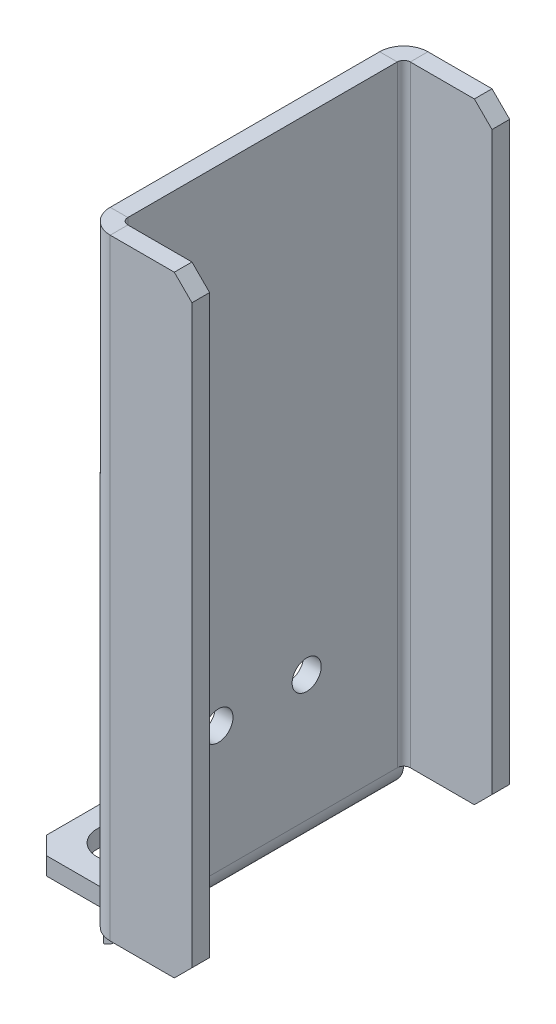
ISO-10303-21;
HEADER;
FILE_DESCRIPTION(('STEP AP214'),'2;1');
FILE_NAME('part.step','',(''),(''),'','','');
FILE_SCHEMA(('AUTOMOTIVE_DESIGN { 1 0 10303 214 1 1 1 1 }'));
ENDSEC;
DATA;
#1=APPLICATION_CONTEXT('core data for automotive mechanical design processes');
#2=APPLICATION_PROTOCOL_DEFINITION('international standard','automotive_design',2000,#1);
#3=PRODUCT_CONTEXT('',#1,'mechanical');
#4=PRODUCT('Part','Part','',(#3));
#5=PRODUCT_RELATED_PRODUCT_CATEGORY('part','',(#4));
#6=PRODUCT_DEFINITION_FORMATION('','',#4);
#7=PRODUCT_DEFINITION_CONTEXT('part definition',#1,'design');
#8=PRODUCT_DEFINITION('design','',#6,#7);
#9=PRODUCT_DEFINITION_SHAPE('','',#8);
#10=(LENGTH_UNIT() NAMED_UNIT(*) SI_UNIT(.MILLI.,.METRE.));
#11=(NAMED_UNIT(*) PLANE_ANGLE_UNIT() SI_UNIT($,.RADIAN.));
#12=(NAMED_UNIT(*) SI_UNIT($,.STERADIAN.) SOLID_ANGLE_UNIT());
#13=UNCERTAINTY_MEASURE_WITH_UNIT(LENGTH_MEASURE(1.E-05),#10,'distance_accuracy_value','');
#14=(GEOMETRIC_REPRESENTATION_CONTEXT(3) GLOBAL_UNCERTAINTY_ASSIGNED_CONTEXT((#13)) GLOBAL_UNIT_ASSIGNED_CONTEXT((#10,
#11,#12)) REPRESENTATION_CONTEXT('',''));
#15=CARTESIAN_POINT('',(0.,0.,0.));
#16=DIRECTION('',(0.,0.,1.));
#17=DIRECTION('',(1.,0.,0.));
#18=AXIS2_PLACEMENT_3D('',#15,#16,#17);
#19=CARTESIAN_POINT('',(2.,0.736600000000004,-15.2634));
#20=DIRECTION('',(0.,1.,0.));
#21=DIRECTION('',(0.,0.,1.));
#22=AXIS2_PLACEMENT_3D('',#19,#20,#21);
#23=PLANE('',#22);
#24=DIRECTION('',(0.,0.,1.));
#25=VECTOR('',#24,1.);
#26=CARTESIAN_POINT('',(0.,0.736599999999782,15.9999999999995));
#27=LINE('',#26,#25);
#28=CARTESIAN_POINT('',(0.,0.736600000000009,-16.));
#29=VERTEX_POINT('',#28);
#30=CARTESIAN_POINT('',(0.,0.736600000000007,-15.2634));
#31=VERTEX_POINT('',#30);
#32=EDGE_CURVE('E331',#29,#31,#27,.T.);
#33=ORIENTED_EDGE('',*,*,#32,.T.);
#34=CARTESIAN_POINT('',(2.7366,0.736600000000004,-15.2634));
#35=DIRECTION('',(0.,1.,0.));
#36=DIRECTION('',(0.,0.,1.));
#37=AXIS2_PLACEMENT_3D('',#34,#35,#36);
#38=CIRCLE('',#37,2.7366);
#39=CARTESIAN_POINT('',(0.100997602065133,0.736600000000004,-16.));
#40=VERTEX_POINT('',#39);
#41=EDGE_CURVE('E269',#31,#40,#38,.F.);
#42=ORIENTED_EDGE('',*,*,#41,.T.);
#43=DIRECTION('',(-1.,0.,0.));
#44=VECTOR('',#43,1.);
#45=CARTESIAN_POINT('',(2.,0.736600000000009,-16.));
#46=LINE('',#45,#44);
#47=EDGE_CURVE('E404',#40,#29,#46,.T.);
#48=ORIENTED_EDGE('',*,*,#47,.T.);
#49=EDGE_LOOP('',(#33,#42,#48));
#50=FACE_BOUND('',#49,.T.);
#51=ADVANCED_FACE('F36',(#50),#23,.T.);
#52=CARTESIAN_POINT('',(2.,0.736600000000009,16.));
#53=DIRECTION('',(0.,1.,0.));
#54=DIRECTION('',(0.,0.,1.));
#55=AXIS2_PLACEMENT_3D('',#52,#53,#54);
#56=PLANE('',#55);
#57=DIRECTION('',(1.,0.,0.));
#58=VECTOR('',#57,1.);
#59=CARTESIAN_POINT('',(0.,0.736600000000004,16.));
#60=LINE('',#59,#58);
#61=CARTESIAN_POINT('',(0.,0.736600000000004,16.));
#62=VERTEX_POINT('',#61);
#63=CARTESIAN_POINT('',(0.100997602065133,0.736600000000004,16.));
#64=VERTEX_POINT('',#63);
#65=EDGE_CURVE('E409',#62,#64,#60,.T.);
#66=ORIENTED_EDGE('',*,*,#65,.T.);
#67=CARTESIAN_POINT('',(2.7366,0.736600000000004,15.2634));
#68=DIRECTION('',(0.,-1.,0.));
#69=DIRECTION('',(0.,0.,-1.));
#70=AXIS2_PLACEMENT_3D('',#67,#68,#69);
#71=CIRCLE('',#70,2.7366);
#72=CARTESIAN_POINT('',(0.,0.736600000000004,15.2634));
#73=VERTEX_POINT('',#72);
#74=EDGE_CURVE('E318',#64,#73,#71,.T.);
#75=ORIENTED_EDGE('',*,*,#74,.T.);
#76=DIRECTION('',(0.,0.,1.));
#77=VECTOR('',#76,1.);
#78=CARTESIAN_POINT('',(0.,0.736600000000004,16.0000000000005));
#79=LINE('',#78,#77);
#80=EDGE_CURVE('E418',#73,#62,#79,.T.);
#81=ORIENTED_EDGE('',*,*,#80,.T.);
#82=EDGE_LOOP('',(#66,#75,#81));
#83=FACE_BOUND('',#82,.T.);
#84=ADVANCED_FACE('F511',(#83),#56,.T.);
#85=CARTESIAN_POINT('',(2.,70.,16.));
#86=DIRECTION('',(1.,0.,0.));
#87=DIRECTION('',(0.,1.,0.));
#88=AXIS2_PLACEMENT_3D('',#85,#86,#87);
#89=PLANE('',#88);
#90=CARTESIAN_POINT('',(2.,15.,5.));
#91=DIRECTION('',(1.,0.,0.));
#92=DIRECTION('',(0.,0.,-1.));
#93=AXIS2_PLACEMENT_3D('',#90,#91,#92);
#94=CIRCLE('',#93,1.65);
#95=CARTESIAN_POINT('',(2.,15.,3.35));
#96=VERTEX_POINT('',#95);
#97=EDGE_CURVE('E428',#96,#96,#94,.T.);
#98=ORIENTED_EDGE('',*,*,#97,.F.);
#99=EDGE_LOOP('',(#98));
#100=FACE_BOUND('',#99,.T.);
#101=CARTESIAN_POINT('',(2.,15.,-5.));
#102=DIRECTION('',(1.,0.,0.));
#103=DIRECTION('',(0.,0.,-1.));
#104=AXIS2_PLACEMENT_3D('',#101,#102,#103);
#105=CIRCLE('',#104,1.65);
#106=CARTESIAN_POINT('',(2.,15.,-6.65));
#107=VERTEX_POINT('',#106);
#108=EDGE_CURVE('E424',#107,#107,#105,.T.);
#109=ORIENTED_EDGE('',*,*,#108,.F.);
#110=EDGE_LOOP('',(#109));
#111=FACE_BOUND('',#110,.T.);
#112=DIRECTION('',(0.,0.,-1.));
#113=VECTOR('',#112,1.);
#114=CARTESIAN_POINT('',(2.,0.736600000000009,16.));
#115=LINE('',#114,#113);
#116=CARTESIAN_POINT('',(2.,0.736600000000004,15.2634));
#117=VERTEX_POINT('',#116);
#118=CARTESIAN_POINT('',(2.,0.736600000000009,-15.2634));
#119=VERTEX_POINT('',#118);
#120=EDGE_CURVE('E391',#117,#119,#115,.T.);
#121=ORIENTED_EDGE('',*,*,#120,.T.);
#122=DIRECTION('',(0.,1.,0.));
#123=VECTOR('',#122,1.);
#124=CARTESIAN_POINT('',(2.,70.,-15.2634));
#125=LINE('',#124,#123);
#126=CARTESIAN_POINT('',(2.,70.,-15.2634));
#127=VERTEX_POINT('',#126);
#128=EDGE_CURVE('E274',#127,#119,#125,.F.);
#129=ORIENTED_EDGE('',*,*,#128,.F.);
#130=DIRECTION('',(0.,0.,-1.));
#131=VECTOR('',#130,1.);
#132=CARTESIAN_POINT('',(2.,70.,16.));
#133=LINE('',#132,#131);
#134=CARTESIAN_POINT('',(2.,70.,15.2634));
#135=VERTEX_POINT('',#134);
#136=EDGE_CURVE('E388',#135,#127,#133,.T.);
#137=ORIENTED_EDGE('',*,*,#136,.F.);
#138=DIRECTION('',(0.,-1.,0.));
#139=VECTOR('',#138,1.);
#140=CARTESIAN_POINT('',(2.,0.736600000000004,15.2634));
#141=LINE('',#140,#139);
#142=EDGE_CURVE('E321',#117,#135,#141,.F.);
#143=ORIENTED_EDGE('',*,*,#142,.F.);
#144=EDGE_LOOP('',(#121,#129,#137,#143));
#145=FACE_BOUND('',#144,.T.);
#146=ADVANCED_FACE('F507',(#100,#111,#145),#89,.T.);
#147=CARTESIAN_POINT('',(0.,70.,16.));
#148=DIRECTION('',(1.,0.,0.));
#149=DIRECTION('',(0.,1.,0.));
#150=AXIS2_PLACEMENT_3D('',#147,#148,#149);
#151=PLANE('',#150);
#152=CARTESIAN_POINT('',(0.,15.,5.));
#153=DIRECTION('',(1.,0.,0.));
#154=DIRECTION('',(0.,1.,0.));
#155=AXIS2_PLACEMENT_3D('',#152,#153,#154);
#156=CIRCLE('',#155,1.65);
#157=CARTESIAN_POINT('',(0.,16.65,5.));
#158=VERTEX_POINT('',#157);
#159=EDGE_CURVE('E425',#158,#158,#156,.T.);
#160=ORIENTED_EDGE('',*,*,#159,.T.);
#161=EDGE_LOOP('',(#160));
#162=FACE_BOUND('',#161,.T.);
#163=CARTESIAN_POINT('',(0.,15.,-5.));
#164=DIRECTION('',(1.,0.,0.));
#165=DIRECTION('',(0.,1.,0.));
#166=AXIS2_PLACEMENT_3D('',#163,#164,#165);
#167=CIRCLE('',#166,1.65);
#168=CARTESIAN_POINT('',(0.,16.65,-5.));
#169=VERTEX_POINT('',#168);
#170=EDGE_CURVE('E421',#169,#169,#167,.T.);
#171=ORIENTED_EDGE('',*,*,#170,.T.);
#172=EDGE_LOOP('',(#171));
#173=FACE_BOUND('',#172,.T.);
#174=DIRECTION('',(0.,1.,0.));
#175=VECTOR('',#174,1.);
#176=CARTESIAN_POINT('',(0.,70.,-15.2634));
#177=LINE('',#176,#175);
#178=CARTESIAN_POINT('',(0.,70.,-15.2634));
#179=VERTEX_POINT('',#178);
#180=EDGE_CURVE('E239',#179,#31,#177,.F.);
#181=ORIENTED_EDGE('',*,*,#180,.T.);
#182=ORIENTED_EDGE('',*,*,#32,.F.);
#183=DIRECTION('',(0.,1.,0.));
#184=VECTOR('',#183,1.);
#185=CARTESIAN_POINT('',(0.,-2.,-16.));
#186=LINE('',#185,#184);
#187=CARTESIAN_POINT('',(0.,-1.89900239793487,-16.));
#188=VERTEX_POINT('',#187);
#189=EDGE_CURVE('E350',#188,#29,#186,.T.);
#190=ORIENTED_EDGE('',*,*,#189,.F.);
#191=DIRECTION('',(0.,0.,-1.));
#192=VECTOR('',#191,1.);
#193=CARTESIAN_POINT('',(0.,-1.89900239793487,16.));
#194=LINE('',#193,#192);
#195=CARTESIAN_POINT('',(0.,-1.89900239793486,-12.5));
#196=VERTEX_POINT('',#195);
#197=EDGE_CURVE('E353',#188,#196,#194,.F.);
#198=ORIENTED_EDGE('',*,*,#197,.T.);
#199=DIRECTION('',(0.,1.,0.));
#200=VECTOR('',#199,1.);
#201=CARTESIAN_POINT('',(0.,-2.,-12.5));
#202=LINE('',#201,#200);
#203=CARTESIAN_POINT('',(0.,0.736600000000002,-12.5));
#204=VERTEX_POINT('',#203);
#205=EDGE_CURVE('E349',#196,#204,#202,.T.);
#206=ORIENTED_EDGE('',*,*,#205,.T.);
#207=DIRECTION('',(0.,0.,-1.));
#208=VECTOR('',#207,1.);
#209=CARTESIAN_POINT('',(0.,0.736600000000004,16.));
#210=LINE('',#209,#208);
#211=CARTESIAN_POINT('',(0.,0.736600000000002,12.5));
#212=VERTEX_POINT('',#211);
#213=EDGE_CURVE('E383',#212,#204,#210,.T.);
#214=ORIENTED_EDGE('',*,*,#213,.F.);
#215=DIRECTION('',(0.,1.,0.));
#216=VECTOR('',#215,1.);
#217=CARTESIAN_POINT('',(0.,-2.,12.5));
#218=LINE('',#217,#216);
#219=CARTESIAN_POINT('',(0.,-1.89900239793486,12.5));
#220=VERTEX_POINT('',#219);
#221=EDGE_CURVE('E338',#220,#212,#218,.T.);
#222=ORIENTED_EDGE('',*,*,#221,.F.);
#223=DIRECTION('',(0.,0.,-1.));
#224=VECTOR('',#223,1.);
#225=CARTESIAN_POINT('',(0.,-1.89900239793486,16.));
#226=LINE('',#225,#224);
#227=CARTESIAN_POINT('',(0.,-1.89900239793486,16.));
#228=VERTEX_POINT('',#227);
#229=EDGE_CURVE('E340',#220,#228,#226,.F.);
#230=ORIENTED_EDGE('',*,*,#229,.T.);
#231=DIRECTION('',(0.,1.,0.));
#232=VECTOR('',#231,1.);
#233=CARTESIAN_POINT('',(0.,-2.,16.));
#234=LINE('',#233,#232);
#235=EDGE_CURVE('E337',#228,#62,#234,.T.);
#236=ORIENTED_EDGE('',*,*,#235,.T.);
#237=ORIENTED_EDGE('',*,*,#80,.F.);
#238=DIRECTION('',(0.,-1.,0.));
#239=VECTOR('',#238,1.);
#240=CARTESIAN_POINT('',(0.,0.736600000000004,15.2634));
#241=LINE('',#240,#239);
#242=CARTESIAN_POINT('',(0.,70.,15.2634));
#243=VERTEX_POINT('',#242);
#244=EDGE_CURVE('E308',#73,#243,#241,.F.);
#245=ORIENTED_EDGE('',*,*,#244,.T.);
#246=DIRECTION('',(0.,0.,-1.));
#247=VECTOR('',#246,1.);
#248=CARTESIAN_POINT('',(0.,70.,16.));
#249=LINE('',#248,#247);
#250=EDGE_CURVE('E385',#243,#179,#249,.T.);
#251=ORIENTED_EDGE('',*,*,#250,.T.);
#252=EDGE_LOOP('',(#181,#182,#190,#198,#206,#214,#222,#230,#236,#237,#245,#251));
#253=FACE_BOUND('',#252,.T.);
#254=ADVANCED_FACE('F510',(#162,#173,#253),#151,.F.);
#255=CARTESIAN_POINT('',(0.,70.,16.));
#256=DIRECTION('',(0.,1.,0.));
#257=DIRECTION('',(0.,0.,1.));
#258=AXIS2_PLACEMENT_3D('',#255,#256,#257);
#259=PLANE('',#258);
#260=ORIENTED_EDGE('',*,*,#136,.T.);
#261=DIRECTION('',(-1.,0.,0.));
#262=VECTOR('',#261,1.);
#263=CARTESIAN_POINT('',(2.,70.,-15.2634));
#264=LINE('',#263,#262);
#265=EDGE_CURVE('E270',#127,#179,#264,.T.);
#266=ORIENTED_EDGE('',*,*,#265,.T.);
#267=ORIENTED_EDGE('',*,*,#250,.F.);
#268=DIRECTION('',(-1.,0.,0.));
#269=VECTOR('',#268,1.);
#270=CARTESIAN_POINT('',(2.,70.,15.2634));
#271=LINE('',#270,#269);
#272=EDGE_CURVE('E314',#135,#243,#271,.T.);
#273=ORIENTED_EDGE('',*,*,#272,.F.);
#274=EDGE_LOOP('',(#260,#266,#267,#273));
#275=FACE_BOUND('',#274,.T.);
#276=ADVANCED_FACE('F533',(#275),#259,.T.);
#277=CARTESIAN_POINT('',(0.,0.736600000000004,16.));
#278=DIRECTION('',(0.,0.,1.));
#279=DIRECTION('',(1.,0.,0.));
#280=AXIS2_PLACEMENT_3D('',#277,#278,#279);
#281=PLANE('',#280);
#282=ORIENTED_EDGE('',*,*,#235,.F.);
#283=CARTESIAN_POINT('',(-0.7366,0.736600000000002,16.));
#284=DIRECTION('',(0.,0.,1.));
#285=DIRECTION('',(1.,0.,0.));
#286=AXIS2_PLACEMENT_3D('',#283,#284,#285);
#287=CIRCLE('',#286,2.7366);
#288=CARTESIAN_POINT('',(2.,0.736600000000009,16.));
#289=VERTEX_POINT('',#288);
#290=EDGE_CURVE('E376',#289,#228,#287,.F.);
#291=ORIENTED_EDGE('',*,*,#290,.F.);
#292=EDGE_CURVE('E408',#64,#289,#60,.T.);
#293=ORIENTED_EDGE('',*,*,#292,.F.);
#294=ORIENTED_EDGE('',*,*,#65,.F.);
#295=EDGE_LOOP('',(#282,#291,#293,#294));
#296=FACE_BOUND('',#295,.T.);
#297=ADVANCED_FACE('F619',(#296),#281,.T.);
#298=CARTESIAN_POINT('',(-0.7366,0.,-16.));
#299=DIRECTION('',(0.,0.,-1.));
#300=DIRECTION('',(-1.,0.,0.));
#301=AXIS2_PLACEMENT_3D('',#298,#299,#300);
#302=PLANE('',#301);
#303=ORIENTED_EDGE('',*,*,#189,.T.);
#304=ORIENTED_EDGE('',*,*,#47,.F.);
#305=CARTESIAN_POINT('',(2.,0.736600000000009,-16.));
#306=VERTEX_POINT('',#305);
#307=EDGE_CURVE('E405',#306,#40,#46,.T.);
#308=ORIENTED_EDGE('',*,*,#307,.F.);
#309=CARTESIAN_POINT('',(-0.7366,0.736600000000002,-16.));
#310=DIRECTION('',(0.,0.,1.));
#311=DIRECTION('',(1.,0.,0.));
#312=AXIS2_PLACEMENT_3D('',#309,#310,#311);
#313=CIRCLE('',#312,2.7366);
#314=EDGE_CURVE('E373',#306,#188,#313,.F.);
#315=ORIENTED_EDGE('',*,*,#314,.T.);
#316=EDGE_LOOP('',(#303,#304,#308,#315));
#317=FACE_BOUND('',#316,.T.);
#318=ADVANCED_FACE('F526',(#317),#302,.T.);
#319=CARTESIAN_POINT('',(0.,0.,16.));
#320=DIRECTION('',(0.,-1.,0.));
#321=DIRECTION('',(1.,0.,0.));
#322=AXIS2_PLACEMENT_3D('',#319,#320,#321);
#323=PLANE('',#322);
#324=CARTESIAN_POINT('',(-7.,0.,7.));
#325=DIRECTION('',(0.,1.,0.));
#326=DIRECTION('',(0.,0.,1.));
#327=AXIS2_PLACEMENT_3D('',#324,#325,#326);
#328=CIRCLE('',#327,2.75);
#329=CARTESIAN_POINT('',(-7.,0.,9.75));
#330=VERTEX_POINT('',#329);
#331=EDGE_CURVE('E363',#330,#330,#328,.T.);
#332=ORIENTED_EDGE('',*,*,#331,.F.);
#333=EDGE_LOOP('',(#332));
#334=FACE_BOUND('',#333,.T.);
#335=CARTESIAN_POINT('',(-7.,0.,-7.));
#336=DIRECTION('',(0.,1.,0.));
#337=DIRECTION('',(0.,0.,1.));
#338=AXIS2_PLACEMENT_3D('',#335,#336,#337);
#339=CIRCLE('',#338,2.75);
#340=CARTESIAN_POINT('',(-7.,0.,-4.25));
#341=VERTEX_POINT('',#340);
#342=EDGE_CURVE('E367',#341,#341,#339,.T.);
#343=ORIENTED_EDGE('',*,*,#342,.F.);
#344=EDGE_LOOP('',(#343));
#345=FACE_BOUND('',#344,.T.);
#346=DIRECTION('',(-1.,0.,0.));
#347=VECTOR('',#346,1.);
#348=CARTESIAN_POINT('',(0.,0.,-12.5));
#349=LINE('',#348,#347);
#350=CARTESIAN_POINT('',(-0.7366,0.,-12.5));
#351=VERTEX_POINT('',#350);
#352=CARTESIAN_POINT('',(-9.99999999999999,0.,-12.5));
#353=VERTEX_POINT('',#352);
#354=EDGE_CURVE('E357',#351,#353,#349,.T.);
#355=ORIENTED_EDGE('',*,*,#354,.T.);
#356=DIRECTION('',(-0.707106781186548,0.,0.707106781186548));
#357=VECTOR('',#356,1.);
#358=CARTESIAN_POINT('',(-10.,0.,-12.5));
#359=LINE('',#358,#357);
#360=CARTESIAN_POINT('',(-12.,0.,-10.5));
#361=VERTEX_POINT('',#360);
#362=EDGE_CURVE('E434',#353,#361,#359,.T.);
#363=ORIENTED_EDGE('',*,*,#362,.T.);
#364=DIRECTION('',(0.,0.,-1.));
#365=VECTOR('',#364,1.);
#366=CARTESIAN_POINT('',(-12.,0.,16.));
#367=LINE('',#366,#365);
#368=CARTESIAN_POINT('',(-12.,0.,10.5));
#369=VERTEX_POINT('',#368);
#370=EDGE_CURVE('E401',#369,#361,#367,.T.);
#371=ORIENTED_EDGE('',*,*,#370,.F.);
#372=DIRECTION('',(0.707106781186549,0.,0.707106781186546));
#373=VECTOR('',#372,1.);
#374=CARTESIAN_POINT('',(-12.,0.,10.5));
#375=LINE('',#374,#373);
#376=CARTESIAN_POINT('',(-9.99999999999999,0.,12.5));
#377=VERTEX_POINT('',#376);
#378=EDGE_CURVE('E432',#369,#377,#375,.T.);
#379=ORIENTED_EDGE('',*,*,#378,.T.);
#380=DIRECTION('',(1.,0.,0.));
#381=VECTOR('',#380,1.);
#382=CARTESIAN_POINT('',(0.,0.,12.5));
#383=LINE('',#382,#381);
#384=CARTESIAN_POINT('',(-0.7366,0.,12.5));
#385=VERTEX_POINT('',#384);
#386=EDGE_CURVE('E343',#377,#385,#383,.T.);
#387=ORIENTED_EDGE('',*,*,#386,.T.);
#388=DIRECTION('',(0.,0.,-1.));
#389=VECTOR('',#388,1.);
#390=CARTESIAN_POINT('',(-0.7366,0.,16.));
#391=LINE('',#390,#389);
#392=EDGE_CURVE('E379',#385,#351,#391,.T.);
#393=ORIENTED_EDGE('',*,*,#392,.T.);
#394=EDGE_LOOP('',(#355,#363,#371,#379,#387,#393));
#395=FACE_BOUND('',#394,.T.);
#396=ADVANCED_FACE('F630',(#334,#345,#395),#323,.F.);
#397=CARTESIAN_POINT('',(-12.,-2.,16.));
#398=DIRECTION('',(-1.,0.,0.));
#399=DIRECTION('',(0.,0.,1.));
#400=AXIS2_PLACEMENT_3D('',#397,#398,#399);
#401=PLANE('',#400);
#402=ORIENTED_EDGE('',*,*,#370,.T.);
#403=DIRECTION('',(0.,-1.,0.));
#404=VECTOR('',#403,1.);
#405=CARTESIAN_POINT('',(-12.,-2.,-10.5));
#406=LINE('',#405,#404);
#407=CARTESIAN_POINT('',(-12.,-2.,-10.5));
#408=VERTEX_POINT('',#407);
#409=EDGE_CURVE('E439',#361,#408,#406,.T.);
#410=ORIENTED_EDGE('',*,*,#409,.T.);
#411=DIRECTION('',(0.,0.,-1.));
#412=VECTOR('',#411,1.);
#413=CARTESIAN_POINT('',(-12.,-2.,16.));
#414=LINE('',#413,#412);
#415=CARTESIAN_POINT('',(-12.,-2.,10.5));
#416=VERTEX_POINT('',#415);
#417=EDGE_CURVE('E398',#416,#408,#414,.T.);
#418=ORIENTED_EDGE('',*,*,#417,.F.);
#419=DIRECTION('',(0.,1.,0.));
#420=VECTOR('',#419,1.);
#421=CARTESIAN_POINT('',(-12.,0.,10.5));
#422=LINE('',#421,#420);
#423=EDGE_CURVE('E436',#416,#369,#422,.T.);
#424=ORIENTED_EDGE('',*,*,#423,.T.);
#425=EDGE_LOOP('',(#402,#410,#418,#424));
#426=FACE_BOUND('',#425,.T.);
#427=ADVANCED_FACE('F626',(#426),#401,.T.);
#428=CARTESIAN_POINT('',(0.,-2.,16.));
#429=DIRECTION('',(0.,-1.,0.));
#430=DIRECTION('',(1.,0.,0.));
#431=AXIS2_PLACEMENT_3D('',#428,#429,#430);
#432=PLANE('',#431);
#433=ORIENTED_EDGE('',*,*,#417,.T.);
#434=DIRECTION('',(0.707106781186548,0.,-0.707106781186548));
#435=VECTOR('',#434,1.);
#436=CARTESIAN_POINT('',(-19.25,-2.,-3.25));
#437=LINE('',#436,#435);
#438=CARTESIAN_POINT('',(-10.,-2.,-12.5));
#439=VERTEX_POINT('',#438);
#440=EDGE_CURVE('E443',#408,#439,#437,.T.);
#441=ORIENTED_EDGE('',*,*,#440,.T.);
#442=DIRECTION('',(1.,0.,0.));
#443=VECTOR('',#442,1.);
#444=CARTESIAN_POINT('',(-12.,-2.,-12.5));
#445=LINE('',#444,#443);
#446=CARTESIAN_POINT('',(-0.7366,-2.,-12.5));
#447=VERTEX_POINT('',#446);
#448=EDGE_CURVE('E347',#439,#447,#445,.T.);
#449=ORIENTED_EDGE('',*,*,#448,.T.);
#450=DIRECTION('',(0.,0.,-1.));
#451=VECTOR('',#450,1.);
#452=CARTESIAN_POINT('',(-0.7366,-2.,16.));
#453=LINE('',#452,#451);
#454=CARTESIAN_POINT('',(-0.7366,-2.,12.5));
#455=VERTEX_POINT('',#454);
#456=EDGE_CURVE('E395',#455,#447,#453,.T.);
#457=ORIENTED_EDGE('',*,*,#456,.F.);
#458=DIRECTION('',(-1.,0.,0.));
#459=VECTOR('',#458,1.);
#460=CARTESIAN_POINT('',(-12.,-2.,12.5));
#461=LINE('',#460,#459);
#462=CARTESIAN_POINT('',(-9.99999999999999,-2.,12.5));
#463=VERTEX_POINT('',#462);
#464=EDGE_CURVE('E334',#455,#463,#461,.T.);
#465=ORIENTED_EDGE('',*,*,#464,.T.);
#466=DIRECTION('',(-0.707106781186549,0.,-0.707106781186546));
#467=VECTOR('',#466,1.);
#468=CARTESIAN_POINT('',(-3.24999999999998,-2.,19.25));
#469=LINE('',#468,#467);
#470=EDGE_CURVE('E441',#463,#416,#469,.T.);
#471=ORIENTED_EDGE('',*,*,#470,.T.);
#472=EDGE_LOOP('',(#433,#441,#449,#457,#465,#471));
#473=FACE_BOUND('',#472,.T.);
#474=CARTESIAN_POINT('',(-7.,-2.,7.));
#475=DIRECTION('',(0.,1.,0.));
#476=DIRECTION('',(0.,0.,1.));
#477=AXIS2_PLACEMENT_3D('',#474,#475,#476);
#478=CIRCLE('',#477,2.75);
#479=CARTESIAN_POINT('',(-7.,-2.,9.75));
#480=VERTEX_POINT('',#479);
#481=EDGE_CURVE('E364',#480,#480,#478,.T.);
#482=ORIENTED_EDGE('',*,*,#481,.T.);
#483=EDGE_LOOP('',(#482));
#484=FACE_BOUND('',#483,.T.);
#485=CARTESIAN_POINT('',(-7.,-2.,-7.));
#486=DIRECTION('',(0.,1.,0.));
#487=DIRECTION('',(0.,0.,1.));
#488=AXIS2_PLACEMENT_3D('',#485,#486,#487);
#489=CIRCLE('',#488,2.75);
#490=CARTESIAN_POINT('',(-7.,-2.,-4.25));
#491=VERTEX_POINT('',#490);
#492=EDGE_CURVE('E370',#491,#491,#489,.T.);
#493=ORIENTED_EDGE('',*,*,#492,.T.);
#494=EDGE_LOOP('',(#493));
#495=FACE_BOUND('',#494,.T.);
#496=ADVANCED_FACE('F623',(#473,#484,#495),#432,.T.);
#497=CARTESIAN_POINT('',(-0.7366,0.736600000000002,16.));
#498=DIRECTION('',(0.,0.,-1.));
#499=DIRECTION('',(-1.,0.,0.));
#500=AXIS2_PLACEMENT_3D('',#497,#498,#499);
#501=CYLINDRICAL_SURFACE('',#500,2.7366);
#502=CARTESIAN_POINT('',(-0.7366,0.736600000000002,12.5));
#503=DIRECTION('',(0.,0.,-1.));
#504=DIRECTION('',(-1.,0.,0.));
#505=AXIS2_PLACEMENT_3D('',#502,#503,#504);
#506=CIRCLE('',#505,2.7366);
#507=EDGE_CURVE('E345',#455,#220,#506,.F.);
#508=ORIENTED_EDGE('',*,*,#507,.F.);
#509=ORIENTED_EDGE('',*,*,#456,.T.);
#510=CARTESIAN_POINT('',(-0.7366,0.736600000000002,-12.5));
#511=DIRECTION('',(0.,0.,1.));
#512=DIRECTION('',(1.,0.,0.));
#513=AXIS2_PLACEMENT_3D('',#510,#511,#512);
#514=CIRCLE('',#513,2.7366);
#515=EDGE_CURVE('E360',#196,#447,#514,.F.);
#516=ORIENTED_EDGE('',*,*,#515,.F.);
#517=ORIENTED_EDGE('',*,*,#197,.F.);
#518=ORIENTED_EDGE('',*,*,#314,.F.);
#519=DIRECTION('',(0.,0.,-1.));
#520=VECTOR('',#519,1.);
#521=CARTESIAN_POINT('',(2.,0.736600000000004,-15.2634));
#522=LINE('',#521,#520);
#523=EDGE_CURVE('E328',#119,#306,#522,.T.);
#524=ORIENTED_EDGE('',*,*,#523,.F.);
#525=ORIENTED_EDGE('',*,*,#120,.F.);
#526=EDGE_CURVE('E392',#289,#117,#115,.T.);
#527=ORIENTED_EDGE('',*,*,#526,.F.);
#528=ORIENTED_EDGE('',*,*,#290,.T.);
#529=ORIENTED_EDGE('',*,*,#229,.F.);
#530=EDGE_LOOP('',(#508,#509,#516,#517,#518,#524,#525,#527,#528,#529));
#531=FACE_BOUND('',#530,.T.);
#532=ADVANCED_FACE('F613',(#531),#501,.T.);
#533=CARTESIAN_POINT('',(-0.7366,0.736600000000002,16.));
#534=DIRECTION('',(0.,0.,-1.));
#535=DIRECTION('',(-1.,0.,0.));
#536=AXIS2_PLACEMENT_3D('',#533,#534,#535);
#537=CYLINDRICAL_SURFACE('',#536,0.7366);
#538=ORIENTED_EDGE('',*,*,#392,.F.);
#539=CARTESIAN_POINT('',(-0.7366,0.736600000000002,12.5));
#540=DIRECTION('',(0.,0.,-1.));
#541=DIRECTION('',(-1.,0.,0.));
#542=AXIS2_PLACEMENT_3D('',#539,#540,#541);
#543=CIRCLE('',#542,0.7366);
#544=EDGE_CURVE('E415',#385,#212,#543,.F.);
#545=ORIENTED_EDGE('',*,*,#544,.T.);
#546=ORIENTED_EDGE('',*,*,#213,.T.);
#547=CARTESIAN_POINT('',(-0.7366,0.736600000000002,-12.5));
#548=DIRECTION('',(0.,0.,1.));
#549=DIRECTION('',(1.,0.,0.));
#550=AXIS2_PLACEMENT_3D('',#547,#548,#549);
#551=CIRCLE('',#550,0.7366);
#552=EDGE_CURVE('E412',#204,#351,#551,.F.);
#553=ORIENTED_EDGE('',*,*,#552,.T.);
#554=EDGE_LOOP('',(#538,#545,#546,#553));
#555=FACE_BOUND('',#554,.T.);
#556=ADVANCED_FACE('F609',(#555),#537,.F.);
#557=CARTESIAN_POINT('',(-7.,-2.,-7.));
#558=DIRECTION('',(0.,1.,0.));
#559=DIRECTION('',(0.,0.,1.));
#560=AXIS2_PLACEMENT_3D('',#557,#558,#559);
#561=CYLINDRICAL_SURFACE('',#560,2.75);
#562=ORIENTED_EDGE('',*,*,#492,.F.);
#563=EDGE_LOOP('',(#562));
#564=FACE_BOUND('',#563,.T.);
#565=ORIENTED_EDGE('',*,*,#342,.T.);
#566=EDGE_LOOP('',(#565));
#567=FACE_BOUND('',#566,.T.);
#568=ADVANCED_FACE('F605',(#564,#567),#561,.F.);
#569=CARTESIAN_POINT('',(-7.,-2.,7.));
#570=DIRECTION('',(0.,1.,0.));
#571=DIRECTION('',(0.,0.,1.));
#572=AXIS2_PLACEMENT_3D('',#569,#570,#571);
#573=CYLINDRICAL_SURFACE('',#572,2.75);
#574=ORIENTED_EDGE('',*,*,#481,.F.);
#575=EDGE_LOOP('',(#574));
#576=FACE_BOUND('',#575,.T.);
#577=ORIENTED_EDGE('',*,*,#331,.T.);
#578=EDGE_LOOP('',(#577));
#579=FACE_BOUND('',#578,.T.);
#580=ADVANCED_FACE('F601',(#576,#579),#573,.F.);
#581=CARTESIAN_POINT('',(-12.,-2.,-12.5));
#582=DIRECTION('',(0.,0.,1.));
#583=DIRECTION('',(1.,0.,0.));
#584=AXIS2_PLACEMENT_3D('',#581,#582,#583);
#585=PLANE('',#584);
#586=ORIENTED_EDGE('',*,*,#448,.F.);
#587=DIRECTION('',(0.,1.,0.));
#588=VECTOR('',#587,1.);
#589=CARTESIAN_POINT('',(-10.,0.,-12.5));
#590=LINE('',#589,#588);
#591=EDGE_CURVE('E429',#439,#353,#590,.T.);
#592=ORIENTED_EDGE('',*,*,#591,.T.);
#593=ORIENTED_EDGE('',*,*,#354,.F.);
#594=ORIENTED_EDGE('',*,*,#552,.F.);
#595=ORIENTED_EDGE('',*,*,#205,.F.);
#596=ORIENTED_EDGE('',*,*,#515,.T.);
#597=EDGE_LOOP('',(#586,#592,#593,#594,#595,#596));
#598=FACE_BOUND('',#597,.T.);
#599=ADVANCED_FACE('F597',(#598),#585,.F.);
#600=CARTESIAN_POINT('',(-12.,-2.,12.5));
#601=DIRECTION('',(0.,0.,-1.));
#602=DIRECTION('',(-1.,0.,0.));
#603=AXIS2_PLACEMENT_3D('',#600,#601,#602);
#604=PLANE('',#603);
#605=ORIENTED_EDGE('',*,*,#386,.F.);
#606=DIRECTION('',(0.,-1.,0.));
#607=VECTOR('',#606,1.);
#608=CARTESIAN_POINT('',(-9.99999999999999,-2.,12.5));
#609=LINE('',#608,#607);
#610=EDGE_CURVE('E445',#377,#463,#609,.T.);
#611=ORIENTED_EDGE('',*,*,#610,.T.);
#612=ORIENTED_EDGE('',*,*,#464,.F.);
#613=ORIENTED_EDGE('',*,*,#507,.T.);
#614=ORIENTED_EDGE('',*,*,#221,.T.);
#615=ORIENTED_EDGE('',*,*,#544,.F.);
#616=EDGE_LOOP('',(#605,#611,#612,#613,#614,#615));
#617=FACE_BOUND('',#616,.T.);
#618=ADVANCED_FACE('F594',(#617),#604,.F.);
#619=CARTESIAN_POINT('',(2.7366,70.,15.2634));
#620=DIRECTION('',(0.,1.,0.));
#621=DIRECTION('',(0.,0.,1.));
#622=AXIS2_PLACEMENT_3D('',#619,#620,#621);
#623=PLANE('',#622);
#624=DIRECTION('',(0.,0.,1.));
#625=VECTOR('',#624,1.);
#626=CARTESIAN_POINT('',(2.7366,70.,16.));
#627=LINE('',#626,#625);
#628=CARTESIAN_POINT('',(2.73659999999999,70.,16.));
#629=VERTEX_POINT('',#628);
#630=CARTESIAN_POINT('',(2.73659999999999,70.,18.));
#631=VERTEX_POINT('',#630);
#632=EDGE_CURVE('E279',#629,#631,#627,.T.);
#633=ORIENTED_EDGE('',*,*,#632,.F.);
#634=CARTESIAN_POINT('',(2.7366,70.,15.2634));
#635=DIRECTION('',(0.,-1.,0.));
#636=DIRECTION('',(0.,0.,-1.));
#637=AXIS2_PLACEMENT_3D('',#634,#635,#636);
#638=CIRCLE('',#637,0.7366);
#639=EDGE_CURVE('E317',#135,#629,#638,.F.);
#640=ORIENTED_EDGE('',*,*,#639,.F.);
#641=ORIENTED_EDGE('',*,*,#272,.T.);
#642=CARTESIAN_POINT('',(2.7366,70.,15.2634));
#643=DIRECTION('',(0.,-1.,0.));
#644=DIRECTION('',(0.,0.,-1.));
#645=AXIS2_PLACEMENT_3D('',#642,#643,#644);
#646=CIRCLE('',#645,2.7366);
#647=EDGE_CURVE('E310',#243,#631,#646,.F.);
#648=ORIENTED_EDGE('',*,*,#647,.T.);
#649=EDGE_LOOP('',(#633,#640,#641,#648));
#650=FACE_BOUND('',#649,.T.);
#651=ADVANCED_FACE('F537',(#650),#623,.T.);
#652=CARTESIAN_POINT('',(2.7366,0.736600000000004,15.2634));
#653=DIRECTION('',(0.,1.,0.));
#654=DIRECTION('',(0.,0.,1.));
#655=AXIS2_PLACEMENT_3D('',#652,#653,#654);
#656=PLANE('',#655);
#657=CARTESIAN_POINT('',(2.7366,0.736600000000008,18.));
#658=VERTEX_POINT('',#657);
#659=EDGE_CURVE('E311',#658,#64,#71,.T.);
#660=ORIENTED_EDGE('',*,*,#659,.T.);
#661=ORIENTED_EDGE('',*,*,#292,.T.);
#662=ORIENTED_EDGE('',*,*,#526,.T.);
#663=CARTESIAN_POINT('',(2.7366,0.736600000000004,15.2634));
#664=DIRECTION('',(0.,-1.,0.));
#665=DIRECTION('',(0.,0.,-1.));
#666=AXIS2_PLACEMENT_3D('',#663,#664,#665);
#667=CIRCLE('',#666,0.7366);
#668=CARTESIAN_POINT('',(2.73659999999999,0.736600000000004,16.));
#669=VERTEX_POINT('',#668);
#670=EDGE_CURVE('E301',#669,#117,#667,.T.);
#671=ORIENTED_EDGE('',*,*,#670,.F.);
#672=DIRECTION('',(0.,0.,1.));
#673=VECTOR('',#672,1.);
#674=CARTESIAN_POINT('',(2.7366,0.736600000000004,16.));
#675=LINE('',#674,#673);
#676=EDGE_CURVE('E283',#669,#658,#675,.T.);
#677=ORIENTED_EDGE('',*,*,#676,.T.);
#678=EDGE_LOOP('',(#660,#661,#662,#671,#677));
#679=FACE_BOUND('',#678,.T.);
#680=ADVANCED_FACE('F571',(#679),#656,.F.);
#681=CARTESIAN_POINT('',(2.7366,0.736600000000004,15.2634));
#682=DIRECTION('',(0.,-1.,0.));
#683=DIRECTION('',(0.,0.,1.));
#684=AXIS2_PLACEMENT_3D('',#681,#682,#683);
#685=CYLINDRICAL_SURFACE('',#684,2.7366);
#686=ORIENTED_EDGE('',*,*,#244,.F.);
#687=ORIENTED_EDGE('',*,*,#74,.F.);
#688=ORIENTED_EDGE('',*,*,#659,.F.);
#689=DIRECTION('',(0.,-1.,0.));
#690=VECTOR('',#689,1.);
#691=CARTESIAN_POINT('',(2.7366,0.736600000000009,18.));
#692=LINE('',#691,#690);
#693=EDGE_CURVE('E286',#631,#658,#692,.T.);
#694=ORIENTED_EDGE('',*,*,#693,.F.);
#695=ORIENTED_EDGE('',*,*,#647,.F.);
#696=EDGE_LOOP('',(#686,#687,#688,#694,#695));
#697=FACE_BOUND('',#696,.T.);
#698=ADVANCED_FACE('F539',(#697),#685,.T.);
#699=CARTESIAN_POINT('',(2.7366,0.736600000000004,15.2634));
#700=DIRECTION('',(0.,-1.,0.));
#701=DIRECTION('',(0.,0.,1.));
#702=AXIS2_PLACEMENT_3D('',#699,#700,#701);
#703=CYLINDRICAL_SURFACE('',#702,0.7366);
#704=ORIENTED_EDGE('',*,*,#142,.T.);
#705=ORIENTED_EDGE('',*,*,#639,.T.);
#706=DIRECTION('',(0.,-1.,0.));
#707=VECTOR('',#706,1.);
#708=CARTESIAN_POINT('',(2.7366,70.,16.));
#709=LINE('',#708,#707);
#710=EDGE_CURVE('E280',#629,#669,#709,.T.);
#711=ORIENTED_EDGE('',*,*,#710,.T.);
#712=ORIENTED_EDGE('',*,*,#670,.T.);
#713=EDGE_LOOP('',(#704,#705,#711,#712));
#714=FACE_BOUND('',#713,.T.);
#715=ADVANCED_FACE('F574',(#714),#703,.F.);
#716=CARTESIAN_POINT('',(1.99999999999999,0.736600000000009,18.));
#717=DIRECTION('',(0.,-1.,0.));
#718=DIRECTION('',(1.,0.,0.));
#719=AXIS2_PLACEMENT_3D('',#716,#717,#718);
#720=PLANE('',#719);
#721=DIRECTION('',(-1.,0.,0.));
#722=VECTOR('',#721,1.);
#723=CARTESIAN_POINT('',(2.,0.736600000000009,16.));
#724=LINE('',#723,#722);
#725=CARTESIAN_POINT('',(9.99999999999998,0.736599999999999,16.));
#726=VERTEX_POINT('',#725);
#727=EDGE_CURVE('E296',#726,#669,#724,.T.);
#728=ORIENTED_EDGE('',*,*,#727,.F.);
#729=DIRECTION('',(0.,0.,1.));
#730=VECTOR('',#729,1.);
#731=CARTESIAN_POINT('',(9.99999999999997,0.736599999999999,18.));
#732=LINE('',#731,#730);
#733=CARTESIAN_POINT('',(9.99999999999997,0.7366,18.));
#734=VERTEX_POINT('',#733);
#735=EDGE_CURVE('E456',#726,#734,#732,.T.);
#736=ORIENTED_EDGE('',*,*,#735,.T.);
#737=DIRECTION('',(-1.,0.,0.));
#738=VECTOR('',#737,1.);
#739=CARTESIAN_POINT('',(1.99999999999999,0.736600000000009,18.));
#740=LINE('',#739,#738);
#741=EDGE_CURVE('E299',#734,#658,#740,.T.);
#742=ORIENTED_EDGE('',*,*,#741,.T.);
#743=ORIENTED_EDGE('',*,*,#676,.F.);
#744=EDGE_LOOP('',(#728,#736,#742,#743));
#745=FACE_BOUND('',#744,.T.);
#746=ADVANCED_FACE('F568',(#745),#720,.T.);
#747=CARTESIAN_POINT('',(12.,70.,18.));
#748=DIRECTION('',(0.,1.,0.));
#749=DIRECTION('',(0.,0.,1.));
#750=AXIS2_PLACEMENT_3D('',#747,#748,#749);
#751=PLANE('',#750);
#752=DIRECTION('',(1.,0.,0.));
#753=VECTOR('',#752,1.);
#754=CARTESIAN_POINT('',(12.,70.,18.));
#755=LINE('',#754,#753);
#756=CARTESIAN_POINT('',(9.99999999999999,70.,18.));
#757=VERTEX_POINT('',#756);
#758=EDGE_CURVE('E292',#631,#757,#755,.T.);
#759=ORIENTED_EDGE('',*,*,#758,.T.);
#760=DIRECTION('',(0.,0.,-1.));
#761=VECTOR('',#760,1.);
#762=CARTESIAN_POINT('',(9.99999999999999,70.,18.));
#763=LINE('',#762,#761);
#764=CARTESIAN_POINT('',(9.99999999999999,70.,16.));
#765=VERTEX_POINT('',#764);
#766=EDGE_CURVE('E11',#757,#765,#763,.T.);
#767=ORIENTED_EDGE('',*,*,#766,.T.);
#768=DIRECTION('',(1.,0.,0.));
#769=VECTOR('',#768,1.);
#770=CARTESIAN_POINT('',(12.,70.,16.));
#771=LINE('',#770,#769);
#772=EDGE_CURVE('E291',#629,#765,#771,.T.);
#773=ORIENTED_EDGE('',*,*,#772,.F.);
#774=ORIENTED_EDGE('',*,*,#632,.T.);
#775=EDGE_LOOP('',(#759,#767,#773,#774));
#776=FACE_BOUND('',#775,.T.);
#777=ADVANCED_FACE('F551',(#776),#751,.T.);
#778=CARTESIAN_POINT('',(1.99999999999999,0.736600000000009,18.));
#779=DIRECTION('',(0.,0.,1.));
#780=DIRECTION('',(1.,0.,0.));
#781=AXIS2_PLACEMENT_3D('',#778,#779,#780);
#782=PLANE('',#781);
#783=ORIENTED_EDGE('',*,*,#741,.F.);
#784=DIRECTION('',(-0.707106781186551,-0.707106781186544,0.));
#785=VECTOR('',#784,1.);
#786=CARTESIAN_POINT('',(5.99999999999994,-3.26339999999998,18.));
#787=LINE('',#786,#785);
#788=CARTESIAN_POINT('',(12.,2.7366,18.));
#789=VERTEX_POINT('',#788);
#790=EDGE_CURVE('E460',#734,#789,#787,.F.);
#791=ORIENTED_EDGE('',*,*,#790,.T.);
#792=DIRECTION('',(0.,-1.,0.));
#793=VECTOR('',#792,1.);
#794=CARTESIAN_POINT('',(12.,0.736599999999997,18.));
#795=LINE('',#794,#793);
#796=CARTESIAN_POINT('',(12.,68.,18.));
#797=VERTEX_POINT('',#796);
#798=EDGE_CURVE('E295',#797,#789,#795,.T.);
#799=ORIENTED_EDGE('',*,*,#798,.F.);
#800=DIRECTION('',(0.707106781186548,-0.707106781186548,0.));
#801=VECTOR('',#800,1.);
#802=CARTESIAN_POINT('',(40.6317,39.3683,18.0000000000001));
#803=LINE('',#802,#801);
#804=EDGE_CURVE('E458',#797,#757,#803,.F.);
#805=ORIENTED_EDGE('',*,*,#804,.T.);
#806=ORIENTED_EDGE('',*,*,#758,.F.);
#807=ORIENTED_EDGE('',*,*,#693,.T.);
#808=EDGE_LOOP('',(#783,#791,#799,#805,#806,#807));
#809=FACE_BOUND('',#808,.T.);
#810=ADVANCED_FACE('F545',(#809),#782,.T.);
#811=CARTESIAN_POINT('',(2.,0.736600000000009,16.));
#812=DIRECTION('',(0.,0.,1.));
#813=DIRECTION('',(1.,0.,0.));
#814=AXIS2_PLACEMENT_3D('',#811,#812,#813);
#815=PLANE('',#814);
#816=DIRECTION('',(0.,-1.,0.));
#817=VECTOR('',#816,1.);
#818=CARTESIAN_POINT('',(12.,0.736599999999997,16.));
#819=LINE('',#818,#817);
#820=CARTESIAN_POINT('',(12.,68.,16.));
#821=VERTEX_POINT('',#820);
#822=CARTESIAN_POINT('',(12.,2.7366,16.));
#823=VERTEX_POINT('',#822);
#824=EDGE_CURVE('E304',#821,#823,#819,.T.);
#825=ORIENTED_EDGE('',*,*,#824,.T.);
#826=DIRECTION('',(0.707106781186551,0.707106781186544,0.));
#827=VECTOR('',#826,1.);
#828=CARTESIAN_POINT('',(12.,2.7366,16.));
#829=LINE('',#828,#827);
#830=EDGE_CURVE('E454',#823,#726,#829,.F.);
#831=ORIENTED_EDGE('',*,*,#830,.T.);
#832=ORIENTED_EDGE('',*,*,#727,.T.);
#833=ORIENTED_EDGE('',*,*,#710,.F.);
#834=ORIENTED_EDGE('',*,*,#772,.T.);
#835=DIRECTION('',(-0.707106781186548,0.707106781186548,0.));
#836=VECTOR('',#835,1.);
#837=CARTESIAN_POINT('',(9.99999999999999,70.,16.));
#838=LINE('',#837,#836);
#839=EDGE_CURVE('E452',#765,#821,#838,.F.);
#840=ORIENTED_EDGE('',*,*,#839,.T.);
#841=EDGE_LOOP('',(#825,#831,#832,#833,#834,#840));
#842=FACE_BOUND('',#841,.T.);
#843=ADVANCED_FACE('F557',(#842),#815,.F.);
#844=CARTESIAN_POINT('',(12.,0.736599999999997,18.));
#845=DIRECTION('',(1.,0.,0.));
#846=DIRECTION('',(0.,0.,-1.));
#847=AXIS2_PLACEMENT_3D('',#844,#845,#846);
#848=PLANE('',#847);
#849=ORIENTED_EDGE('',*,*,#798,.T.);
#850=DIRECTION('',(0.,0.,-1.));
#851=VECTOR('',#850,1.);
#852=CARTESIAN_POINT('',(12.,2.7366,18.));
#853=LINE('',#852,#851);
#854=EDGE_CURVE('E449',#789,#823,#853,.T.);
#855=ORIENTED_EDGE('',*,*,#854,.T.);
#856=ORIENTED_EDGE('',*,*,#824,.F.);
#857=DIRECTION('',(0.,0.,1.));
#858=VECTOR('',#857,1.);
#859=CARTESIAN_POINT('',(12.,68.,18.));
#860=LINE('',#859,#858);
#861=EDGE_CURVE('E447',#821,#797,#860,.T.);
#862=ORIENTED_EDGE('',*,*,#861,.T.);
#863=EDGE_LOOP('',(#849,#855,#856,#862));
#864=FACE_BOUND('',#863,.T.);
#865=ADVANCED_FACE('F560',(#864),#848,.T.);
#866=CARTESIAN_POINT('',(2.7366,0.736600000000004,-15.2634));
#867=DIRECTION('',(0.,-1.,0.));
#868=DIRECTION('',(0.,0.,-1.));
#869=AXIS2_PLACEMENT_3D('',#866,#867,#868);
#870=PLANE('',#869);
#871=ORIENTED_EDGE('',*,*,#523,.T.);
#872=ORIENTED_EDGE('',*,*,#307,.T.);
#873=CARTESIAN_POINT('',(2.73659999999999,0.736600000000004,-18.));
#874=VERTEX_POINT('',#873);
#875=EDGE_CURVE('E268',#40,#874,#38,.F.);
#876=ORIENTED_EDGE('',*,*,#875,.T.);
#877=DIRECTION('',(0.,0.,-1.));
#878=VECTOR('',#877,1.);
#879=CARTESIAN_POINT('',(2.7366,0.736600000000001,-16.));
#880=LINE('',#879,#878);
#881=CARTESIAN_POINT('',(2.73659999999999,0.736600000000004,-16.));
#882=VERTEX_POINT('',#881);
#883=EDGE_CURVE('E260',#882,#874,#880,.T.);
#884=ORIENTED_EDGE('',*,*,#883,.F.);
#885=CARTESIAN_POINT('',(2.7366,0.736600000000004,-15.2634));
#886=DIRECTION('',(0.,1.,0.));
#887=DIRECTION('',(0.,0.,1.));
#888=AXIS2_PLACEMENT_3D('',#885,#886,#887);
#889=CIRCLE('',#888,0.7366);
#890=EDGE_CURVE('E242',#119,#882,#889,.F.);
#891=ORIENTED_EDGE('',*,*,#890,.F.);
#892=EDGE_LOOP('',(#871,#872,#876,#884,#891));
#893=FACE_BOUND('',#892,.T.);
#894=ADVANCED_FACE('F520',(#893),#870,.T.);
#895=CARTESIAN_POINT('',(2.7366,70.,-15.2634));
#896=DIRECTION('',(0.,-1.,0.));
#897=DIRECTION('',(0.,0.,-1.));
#898=AXIS2_PLACEMENT_3D('',#895,#896,#897);
#899=PLANE('',#898);
#900=CARTESIAN_POINT('',(2.7366,70.,-15.2634));
#901=DIRECTION('',(0.,1.,0.));
#902=DIRECTION('',(0.,0.,1.));
#903=AXIS2_PLACEMENT_3D('',#900,#901,#902);
#904=CIRCLE('',#903,0.7366);
#905=CARTESIAN_POINT('',(2.73659999999999,70.,-16.));
#906=VERTEX_POINT('',#905);
#907=EDGE_CURVE('E226',#906,#127,#904,.T.);
#908=ORIENTED_EDGE('',*,*,#907,.F.);
#909=DIRECTION('',(0.,0.,-1.));
#910=VECTOR('',#909,1.);
#911=CARTESIAN_POINT('',(2.7366,70.,-16.));
#912=LINE('',#911,#910);
#913=CARTESIAN_POINT('',(2.7366,70.,-18.));
#914=VERTEX_POINT('',#913);
#915=EDGE_CURVE('E224',#906,#914,#912,.T.);
#916=ORIENTED_EDGE('',*,*,#915,.T.);
#917=CARTESIAN_POINT('',(2.7366,70.,-15.2634));
#918=DIRECTION('',(0.,1.,0.));
#919=DIRECTION('',(0.,0.,1.));
#920=AXIS2_PLACEMENT_3D('',#917,#918,#919);
#921=CIRCLE('',#920,2.7366);
#922=EDGE_CURVE('E233',#914,#179,#921,.T.);
#923=ORIENTED_EDGE('',*,*,#922,.T.);
#924=ORIENTED_EDGE('',*,*,#265,.F.);
#925=EDGE_LOOP('',(#908,#916,#923,#924));
#926=FACE_BOUND('',#925,.T.);
#927=ADVANCED_FACE('F245',(#926),#899,.F.);
#928=CARTESIAN_POINT('',(2.7366,70.,-15.2634));
#929=DIRECTION('',(0.,1.,0.));
#930=DIRECTION('',(0.,0.,-1.));
#931=AXIS2_PLACEMENT_3D('',#928,#929,#930);
#932=CYLINDRICAL_SURFACE('',#931,2.7366);
#933=ORIENTED_EDGE('',*,*,#180,.F.);
#934=ORIENTED_EDGE('',*,*,#922,.F.);
#935=DIRECTION('',(0.,1.,0.));
#936=VECTOR('',#935,1.);
#937=CARTESIAN_POINT('',(2.7366,70.,-18.));
#938=LINE('',#937,#936);
#939=EDGE_CURVE('E236',#874,#914,#938,.T.);
#940=ORIENTED_EDGE('',*,*,#939,.F.);
#941=ORIENTED_EDGE('',*,*,#875,.F.);
#942=ORIENTED_EDGE('',*,*,#41,.F.);
#943=EDGE_LOOP('',(#933,#934,#940,#941,#942));
#944=FACE_BOUND('',#943,.T.);
#945=ADVANCED_FACE('F234',(#944),#932,.T.);
#946=CARTESIAN_POINT('',(2.7366,70.,-15.2634));
#947=DIRECTION('',(0.,1.,0.));
#948=DIRECTION('',(0.,0.,-1.));
#949=AXIS2_PLACEMENT_3D('',#946,#947,#948);
#950=CYLINDRICAL_SURFACE('',#949,0.7366);
#951=ORIENTED_EDGE('',*,*,#128,.T.);
#952=ORIENTED_EDGE('',*,*,#890,.T.);
#953=DIRECTION('',(0.,1.,0.));
#954=VECTOR('',#953,1.);
#955=CARTESIAN_POINT('',(2.7366,0.736600000000001,-16.));
#956=LINE('',#955,#954);
#957=EDGE_CURVE('E247',#882,#906,#956,.T.);
#958=ORIENTED_EDGE('',*,*,#957,.T.);
#959=ORIENTED_EDGE('',*,*,#907,.T.);
#960=EDGE_LOOP('',(#951,#952,#958,#959));
#961=FACE_BOUND('',#960,.T.);
#962=ADVANCED_FACE('F495',(#961),#950,.F.);
#963=CARTESIAN_POINT('',(1.99999999999999,70.,-18.));
#964=DIRECTION('',(0.,1.,0.));
#965=DIRECTION('',(0.,0.,1.));
#966=AXIS2_PLACEMENT_3D('',#963,#964,#965);
#967=PLANE('',#966);
#968=DIRECTION('',(-1.,0.,0.));
#969=VECTOR('',#968,1.);
#970=CARTESIAN_POINT('',(2.,70.,-16.));
#971=LINE('',#970,#969);
#972=CARTESIAN_POINT('',(9.99999999999997,70.,-16.));
#973=VERTEX_POINT('',#972);
#974=EDGE_CURVE('E262',#973,#906,#971,.T.);
#975=ORIENTED_EDGE('',*,*,#974,.F.);
#976=DIRECTION('',(0.,0.,-1.));
#977=VECTOR('',#976,1.);
#978=CARTESIAN_POINT('',(9.99999999999997,70.,-18.));
#979=LINE('',#978,#977);
#980=CARTESIAN_POINT('',(9.99999999999997,70.,-18.));
#981=VERTEX_POINT('',#980);
#982=EDGE_CURVE('E44',#973,#981,#979,.T.);
#983=ORIENTED_EDGE('',*,*,#982,.T.);
#984=DIRECTION('',(-1.,0.,0.));
#985=VECTOR('',#984,1.);
#986=CARTESIAN_POINT('',(1.99999999999999,70.,-18.));
#987=LINE('',#986,#985);
#988=EDGE_CURVE('E220',#981,#914,#987,.T.);
#989=ORIENTED_EDGE('',*,*,#988,.T.);
#990=ORIENTED_EDGE('',*,*,#915,.F.);
#991=EDGE_LOOP('',(#975,#983,#989,#990));
#992=FACE_BOUND('',#991,.T.);
#993=ADVANCED_FACE('F222',(#992),#967,.T.);
#994=CARTESIAN_POINT('',(12.,0.736599999999993,-18.));
#995=DIRECTION('',(0.,-1.,0.));
#996=DIRECTION('',(1.,0.,0.));
#997=AXIS2_PLACEMENT_3D('',#994,#995,#996);
#998=PLANE('',#997);
#999=DIRECTION('',(1.,0.,0.));
#1000=VECTOR('',#999,1.);
#1001=CARTESIAN_POINT('',(12.,0.736599999999993,-18.));
#1002=LINE('',#1001,#1000);
#1003=CARTESIAN_POINT('',(9.99999999999998,0.736599999999995,-18.));
#1004=VERTEX_POINT('',#1003);
#1005=EDGE_CURVE('E252',#874,#1004,#1002,.T.);
#1006=ORIENTED_EDGE('',*,*,#1005,.T.);
#1007=DIRECTION('',(0.,0.,1.));
#1008=VECTOR('',#1007,1.);
#1009=CARTESIAN_POINT('',(9.99999999999998,0.736599999999997,-18.));
#1010=LINE('',#1009,#1008);
#1011=CARTESIAN_POINT('',(9.99999999999998,0.736599999999997,-16.));
#1012=VERTEX_POINT('',#1011);
#1013=EDGE_CURVE('E462',#1004,#1012,#1010,.T.);
#1014=ORIENTED_EDGE('',*,*,#1013,.T.);
#1015=DIRECTION('',(1.,0.,0.));
#1016=VECTOR('',#1015,1.);
#1017=CARTESIAN_POINT('',(12.,0.736599999999993,-16.));
#1018=LINE('',#1017,#1016);
#1019=EDGE_CURVE('E253',#882,#1012,#1018,.T.);
#1020=ORIENTED_EDGE('',*,*,#1019,.F.);
#1021=ORIENTED_EDGE('',*,*,#883,.T.);
#1022=EDGE_LOOP('',(#1006,#1014,#1020,#1021));
#1023=FACE_BOUND('',#1022,.T.);
#1024=ADVANCED_FACE('F481',(#1023),#998,.T.);
#1025=CARTESIAN_POINT('',(1.99999999999999,70.,-18.));
#1026=DIRECTION('',(0.,0.,-1.));
#1027=DIRECTION('',(-1.,0.,0.));
#1028=AXIS2_PLACEMENT_3D('',#1025,#1026,#1027);
#1029=PLANE('',#1028);
#1030=DIRECTION('',(0.,1.,0.));
#1031=VECTOR('',#1030,1.);
#1032=CARTESIAN_POINT('',(12.,70.,-18.));
#1033=LINE('',#1032,#1031);
#1034=CARTESIAN_POINT('',(12.,2.73659999999999,-18.));
#1035=VERTEX_POINT('',#1034);
#1036=CARTESIAN_POINT('',(12.,68.,-18.));
#1037=VERTEX_POINT('',#1036);
#1038=EDGE_CURVE('E227',#1035,#1037,#1033,.T.);
#1039=ORIENTED_EDGE('',*,*,#1038,.F.);
#1040=DIRECTION('',(0.707106781186549,0.707106781186546,0.));
#1041=VECTOR('',#1040,1.);
#1042=CARTESIAN_POINT('',(40.6317,31.3682999999999,-18.0000000000001));
#1043=LINE('',#1042,#1041);
#1044=EDGE_CURVE('E475',#1035,#1004,#1043,.F.);
#1045=ORIENTED_EDGE('',*,*,#1044,.T.);
#1046=ORIENTED_EDGE('',*,*,#1005,.F.);
#1047=ORIENTED_EDGE('',*,*,#939,.T.);
#1048=ORIENTED_EDGE('',*,*,#988,.F.);
#1049=DIRECTION('',(-0.707106781186551,0.707106781186544,0.));
#1050=VECTOR('',#1049,1.);
#1051=CARTESIAN_POINT('',(5.99999999999994,74.,-18.));
#1052=LINE('',#1051,#1050);
#1053=EDGE_CURVE('E57',#981,#1037,#1052,.F.);
#1054=ORIENTED_EDGE('',*,*,#1053,.T.);
#1055=EDGE_LOOP('',(#1039,#1045,#1046,#1047,#1048,#1054));
#1056=FACE_BOUND('',#1055,.T.);
#1057=ADVANCED_FACE('F250',(#1056),#1029,.T.);
#1058=CARTESIAN_POINT('',(2.,70.,-16.));
#1059=DIRECTION('',(0.,0.,-1.));
#1060=DIRECTION('',(-1.,0.,0.));
#1061=AXIS2_PLACEMENT_3D('',#1058,#1059,#1060);
#1062=PLANE('',#1061);
#1063=ORIENTED_EDGE('',*,*,#1019,.T.);
#1064=DIRECTION('',(-0.707106781186549,-0.707106781186546,0.));
#1065=VECTOR('',#1064,1.);
#1066=CARTESIAN_POINT('',(9.99999999999998,0.736599999999997,-16.));
#1067=LINE('',#1066,#1065);
#1068=CARTESIAN_POINT('',(12.,2.73660000000001,-16.));
#1069=VERTEX_POINT('',#1068);
#1070=EDGE_CURVE('E467',#1012,#1069,#1067,.F.);
#1071=ORIENTED_EDGE('',*,*,#1070,.T.);
#1072=DIRECTION('',(0.,1.,0.));
#1073=VECTOR('',#1072,1.);
#1074=CARTESIAN_POINT('',(12.,70.,-16.));
#1075=LINE('',#1074,#1073);
#1076=CARTESIAN_POINT('',(12.,68.,-16.));
#1077=VERTEX_POINT('',#1076);
#1078=EDGE_CURVE('E256',#1069,#1077,#1075,.T.);
#1079=ORIENTED_EDGE('',*,*,#1078,.T.);
#1080=DIRECTION('',(0.707106781186551,-0.707106781186544,0.));
#1081=VECTOR('',#1080,1.);
#1082=CARTESIAN_POINT('',(12.,68.,-16.));
#1083=LINE('',#1082,#1081);
#1084=EDGE_CURVE('E465',#1077,#973,#1083,.F.);
#1085=ORIENTED_EDGE('',*,*,#1084,.T.);
#1086=ORIENTED_EDGE('',*,*,#974,.T.);
#1087=ORIENTED_EDGE('',*,*,#957,.F.);
#1088=EDGE_LOOP('',(#1063,#1071,#1079,#1085,#1086,#1087));
#1089=FACE_BOUND('',#1088,.T.);
#1090=ADVANCED_FACE('F486',(#1089),#1062,.F.);
#1091=CARTESIAN_POINT('',(12.,70.,-18.));
#1092=DIRECTION('',(1.,0.,0.));
#1093=DIRECTION('',(0.,0.,-1.));
#1094=AXIS2_PLACEMENT_3D('',#1091,#1092,#1093);
#1095=PLANE('',#1094);
#1096=ORIENTED_EDGE('',*,*,#1078,.F.);
#1097=DIRECTION('',(0.,0.,-1.));
#1098=VECTOR('',#1097,1.);
#1099=CARTESIAN_POINT('',(12.,2.73660000000001,-18.));
#1100=LINE('',#1099,#1098);
#1101=EDGE_CURVE('E472',#1069,#1035,#1100,.T.);
#1102=ORIENTED_EDGE('',*,*,#1101,.T.);
#1103=ORIENTED_EDGE('',*,*,#1038,.T.);
#1104=DIRECTION('',(0.,0.,1.));
#1105=VECTOR('',#1104,1.);
#1106=CARTESIAN_POINT('',(12.,68.,-18.));
#1107=LINE('',#1106,#1105);
#1108=EDGE_CURVE('E469',#1037,#1077,#1107,.T.);
#1109=ORIENTED_EDGE('',*,*,#1108,.T.);
#1110=EDGE_LOOP('',(#1096,#1102,#1103,#1109));
#1111=FACE_BOUND('',#1110,.T.);
#1112=ADVANCED_FACE('F489',(#1111),#1095,.T.);
#1113=CARTESIAN_POINT('',(2.,15.,-5.));
#1114=DIRECTION('',(1.,0.,0.));
#1115=DIRECTION('',(0.,0.,-1.));
#1116=AXIS2_PLACEMENT_3D('',#1113,#1114,#1115);
#1117=CYLINDRICAL_SURFACE('',#1116,1.65);
#1118=ORIENTED_EDGE('',*,*,#108,.T.);
#1119=EDGE_LOOP('',(#1118));
#1120=FACE_BOUND('',#1119,.T.);
#1121=ORIENTED_EDGE('',*,*,#170,.F.);
#1122=EDGE_LOOP('',(#1121));
#1123=FACE_BOUND('',#1122,.T.);
#1124=ADVANCED_FACE('F696',(#1120,#1123),#1117,.F.);
#1125=CARTESIAN_POINT('',(2.,15.,5.));
#1126=DIRECTION('',(1.,0.,0.));
#1127=DIRECTION('',(0.,0.,-1.));
#1128=AXIS2_PLACEMENT_3D('',#1125,#1126,#1127);
#1129=CYLINDRICAL_SURFACE('',#1128,1.65);
#1130=ORIENTED_EDGE('',*,*,#97,.T.);
#1131=EDGE_LOOP('',(#1130));
#1132=FACE_BOUND('',#1131,.T.);
#1133=ORIENTED_EDGE('',*,*,#159,.F.);
#1134=EDGE_LOOP('',(#1133));
#1135=FACE_BOUND('',#1134,.T.);
#1136=ADVANCED_FACE('F504',(#1132,#1135),#1129,.F.);
#1137=CARTESIAN_POINT('',(-10.,-2.,-12.5));
#1138=DIRECTION('',(-0.707106781186547,0.,-0.707106781186547));
#1139=DIRECTION('',(-0.707106781186548,0.,0.707106781186548));
#1140=AXIS2_PLACEMENT_3D('',#1137,#1138,#1139);
#1141=PLANE('',#1140);
#1142=ORIENTED_EDGE('',*,*,#440,.F.);
#1143=ORIENTED_EDGE('',*,*,#409,.F.);
#1144=ORIENTED_EDGE('',*,*,#362,.F.);
#1145=ORIENTED_EDGE('',*,*,#591,.F.);
#1146=EDGE_LOOP('',(#1142,#1143,#1144,#1145));
#1147=FACE_BOUND('',#1146,.T.);
#1148=ADVANCED_FACE('F640',(#1147),#1141,.T.);
#1149=CARTESIAN_POINT('',(-12.,-2.,10.5));
#1150=DIRECTION('',(-0.707106781186546,0.,0.707106781186549));
#1151=DIRECTION('',(0.707106781186549,0.,0.707106781186546));
#1152=AXIS2_PLACEMENT_3D('',#1149,#1150,#1151);
#1153=PLANE('',#1152);
#1154=ORIENTED_EDGE('',*,*,#470,.F.);
#1155=ORIENTED_EDGE('',*,*,#610,.F.);
#1156=ORIENTED_EDGE('',*,*,#378,.F.);
#1157=ORIENTED_EDGE('',*,*,#423,.F.);
#1158=EDGE_LOOP('',(#1154,#1155,#1156,#1157));
#1159=FACE_BOUND('',#1158,.T.);
#1160=ADVANCED_FACE('F643',(#1159),#1153,.T.);
#1161=CARTESIAN_POINT('',(12.,2.7366,18.));
#1162=DIRECTION('',(-0.707106781186544,0.707106781186551,0.));
#1163=DIRECTION('',(-0.707106781186551,-0.707106781186544,0.));
#1164=AXIS2_PLACEMENT_3D('',#1161,#1162,#1163);
#1165=PLANE('',#1164);
#1166=ORIENTED_EDGE('',*,*,#790,.F.);
#1167=ORIENTED_EDGE('',*,*,#735,.F.);
#1168=ORIENTED_EDGE('',*,*,#830,.F.);
#1169=ORIENTED_EDGE('',*,*,#854,.F.);
#1170=EDGE_LOOP('',(#1166,#1167,#1168,#1169));
#1171=FACE_BOUND('',#1170,.T.);
#1172=ADVANCED_FACE('F563',(#1171),#1165,.F.);
#1173=CARTESIAN_POINT('',(9.99999999999998,0.736599999999997,-18.));
#1174=DIRECTION('',(-0.707106781186546,0.707106781186549,0.));
#1175=DIRECTION('',(-0.707106781186549,-0.707106781186546,0.));
#1176=AXIS2_PLACEMENT_3D('',#1173,#1174,#1175);
#1177=PLANE('',#1176);
#1178=ORIENTED_EDGE('',*,*,#1044,.F.);
#1179=ORIENTED_EDGE('',*,*,#1101,.F.);
#1180=ORIENTED_EDGE('',*,*,#1070,.F.);
#1181=ORIENTED_EDGE('',*,*,#1013,.F.);
#1182=EDGE_LOOP('',(#1178,#1179,#1180,#1181));
#1183=FACE_BOUND('',#1182,.T.);
#1184=ADVANCED_FACE('F483',(#1183),#1177,.F.);
#1185=CARTESIAN_POINT('',(12.,68.,-18.));
#1186=DIRECTION('',(-0.707106781186544,-0.707106781186551,0.));
#1187=DIRECTION('',(0.707106781186551,-0.707106781186544,0.));
#1188=AXIS2_PLACEMENT_3D('',#1185,#1186,#1187);
#1189=PLANE('',#1188);
#1190=ORIENTED_EDGE('',*,*,#1053,.F.);
#1191=ORIENTED_EDGE('',*,*,#982,.F.);
#1192=ORIENTED_EDGE('',*,*,#1084,.F.);
#1193=ORIENTED_EDGE('',*,*,#1108,.F.);
#1194=EDGE_LOOP('',(#1190,#1191,#1192,#1193));
#1195=FACE_BOUND('',#1194,.T.);
#1196=ADVANCED_FACE('F492',(#1195),#1189,.F.);
#1197=CARTESIAN_POINT('',(9.99999999999999,70.,18.));
#1198=DIRECTION('',(-0.707106781186547,-0.707106781186547,0.));
#1199=DIRECTION('',(0.707106781186548,-0.707106781186548,0.));
#1200=AXIS2_PLACEMENT_3D('',#1197,#1198,#1199);
#1201=PLANE('',#1200);
#1202=ORIENTED_EDGE('',*,*,#804,.F.);
#1203=ORIENTED_EDGE('',*,*,#861,.F.);
#1204=ORIENTED_EDGE('',*,*,#839,.F.);
#1205=ORIENTED_EDGE('',*,*,#766,.F.);
#1206=EDGE_LOOP('',(#1202,#1203,#1204,#1205));
#1207=FACE_BOUND('',#1206,.T.);
#1208=ADVANCED_FACE('F38',(#1207),#1201,.F.);
#1209=CLOSED_SHELL('',(#51,#84,#146,#254,#276,#297,#318,#396,#427,#496,#532,#556,#568,#580,#599,
#618,#651,#680,#698,#715,#746,#777,#810,#843,#865,#894,#927,#945,#962,#993,#1024,#1057,#1090,
#1112,#1124,#1136,#1148,#1160,#1172,#1184,#1196,#1208));
#1210=MANIFOLD_SOLID_BREP('B2',#1209);
#1211=ADVANCED_BREP_SHAPE_REPRESENTATION('',(#18,#1210),#14);
#1212=SHAPE_DEFINITION_REPRESENTATION(#9,#1211);
ENDSEC;
END-ISO-10303-21;
